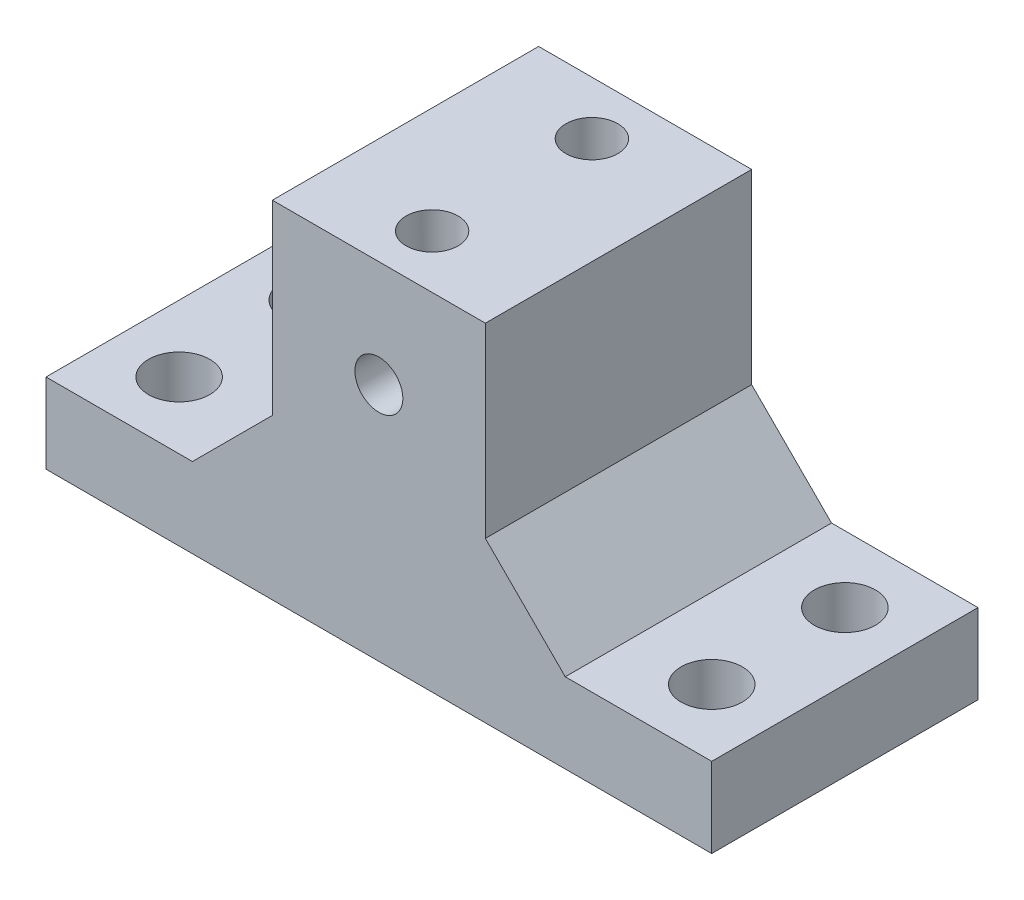
ISO-10303-21;
HEADER;
FILE_DESCRIPTION(('STEP AP214'),'2;1');
FILE_NAME('part.step','',(''),(''),'','','');
FILE_SCHEMA(('AUTOMOTIVE_DESIGN { 1 0 10303 214 1 1 1 1 }'));
ENDSEC;
DATA;
#1=APPLICATION_CONTEXT('core data for automotive mechanical design processes');
#2=APPLICATION_PROTOCOL_DEFINITION('international standard','automotive_design',2000,#1);
#3=PRODUCT_CONTEXT('',#1,'mechanical');
#4=PRODUCT('Part','Part','',(#3));
#5=PRODUCT_RELATED_PRODUCT_CATEGORY('part','',(#4));
#6=PRODUCT_DEFINITION_FORMATION('','',#4);
#7=PRODUCT_DEFINITION_CONTEXT('part definition',#1,'design');
#8=PRODUCT_DEFINITION('design','',#6,#7);
#9=PRODUCT_DEFINITION_SHAPE('','',#8);
#10=(LENGTH_UNIT() NAMED_UNIT(*) SI_UNIT(.MILLI.,.METRE.));
#11=(NAMED_UNIT(*) PLANE_ANGLE_UNIT() SI_UNIT($,.RADIAN.));
#12=(NAMED_UNIT(*) SI_UNIT($,.STERADIAN.) SOLID_ANGLE_UNIT());
#13=UNCERTAINTY_MEASURE_WITH_UNIT(LENGTH_MEASURE(1.E-05),#10,'distance_accuracy_value','');
#14=(GEOMETRIC_REPRESENTATION_CONTEXT(3) GLOBAL_UNCERTAINTY_ASSIGNED_CONTEXT((#13)) GLOBAL_UNIT_ASSIGNED_CONTEXT((#10,
#11,#12)) REPRESENTATION_CONTEXT('',''));
#15=CARTESIAN_POINT('',(0.,0.,0.));
#16=DIRECTION('',(0.,0.,1.));
#17=DIRECTION('',(1.,0.,0.));
#18=AXIS2_PLACEMENT_3D('',#15,#16,#17);
#19=CARTESIAN_POINT('',(0.,9.,5.));
#20=DIRECTION('',(0.,0.,-1.));
#21=DIRECTION('',(-1.,0.,0.));
#22=AXIS2_PLACEMENT_3D('',#19,#20,#21);
#23=CYLINDRICAL_SURFACE('',#22,0.9);
#24=DIRECTION('',(0.,0.,-1.));
#25=VECTOR('',#24,1.);
#26=CARTESIAN_POINT('',(0.748331477354789,9.5,5.));
#27=LINE('',#26,#25);
#28=CARTESIAN_POINT('',(0.748331477354789,9.5,-3.62500000000001));
#29=VERTEX_POINT('',#28);
#30=CARTESIAN_POINT('',(0.748331477354789,9.5,-2.375));
#31=VERTEX_POINT('',#30);
#32=EDGE_CURVE('E200',#29,#31,#27,.F.);
#33=ORIENTED_EDGE('',*,*,#32,.F.);
#34=CARTESIAN_POINT('',(0.748331477354789,9.5,-3.62500000000001));
#35=CARTESIAN_POINT('',(0.733924269891504,9.52154477751129,-3.6422490531976));
#36=CARTESIAN_POINT('',(0.718578885408009,9.54251308621305,-3.65941026645327));
#37=CARTESIAN_POINT('',(0.685911055676356,9.58327909091887,-3.693330659847));
#38=CARTESIAN_POINT('',(0.668585255730175,9.60307471172623,-3.71008909782588));
#39=CARTESIAN_POINT('',(0.613236830258081,9.66091011870187,-3.75962369621174));
#40=CARTESIAN_POINT('',(0.572098248732012,9.6970104059337,-3.79134087464803));
#41=CARTESIAN_POINT('',(0.493298849816799,9.75389963460294,-3.84194485571653));
#42=CARTESIAN_POINT('',(0.45751133756575,9.77622981088076,-3.86202417811574));
#43=CARTESIAN_POINT('',(0.381674185466681,9.81617959913372,-3.89816550918432));
#44=CARTESIAN_POINT('',(0.341642222860576,9.83381775200206,-3.91424331342636));
#45=CARTESIAN_POINT('',(0.264338502822068,9.86112585405695,-3.93922177602969));
#46=CARTESIAN_POINT('',(0.227588421267277,9.87160389569283,-3.94884579537935));
#47=CARTESIAN_POINT('',(0.152193833043917,9.88787484516845,-3.96381346331423));
#48=CARTESIAN_POINT('',(0.113549312703479,9.8936677191908,-3.96915708100363));
#49=CARTESIAN_POINT('',(0.0353491706181292,9.90016316788724,-3.97514980097303));
#50=CARTESIAN_POINT('',(-0.00420880675999397,9.90085064433701,-3.97578497894461));
#51=CARTESIAN_POINT('',(-0.0828547161948614,9.8970425513315,-3.97227044712237));
#52=CARTESIAN_POINT('',(-0.121942637397505,9.89254686242269,-3.96812062705137));
#53=CARTESIAN_POINT('',(-0.196594220862562,9.87904499184437,-3.95568749062408));
#54=CARTESIAN_POINT('',(-0.232236710727224,9.87027079523202,-3.94761684139698));
#55=CARTESIAN_POINT('',(-0.301294462499184,9.84884074498252,-3.92797492866569));
#56=CARTESIAN_POINT('',(-0.33470942379642,9.83618436872209,-3.91640319384439));
#57=CARTESIAN_POINT('',(-0.410964096228035,9.80215197573637,-3.88544039996904));
#58=CARTESIAN_POINT('',(-0.452610168726625,9.77928736420383,-3.86474599339474));
#59=CARTESIAN_POINT('',(-0.53042764849317,9.72857095464448,-3.81933735295521));
#60=CARTESIAN_POINT('',(-0.566579595376692,9.70070215836203,-3.79460944513422));
#61=CARTESIAN_POINT('',(-0.628894552480811,9.64498530037335,-3.74596607812786));
#62=CARTESIAN_POINT('',(-0.6557458542859,9.61761485613098,-3.7223701606621));
#63=CARTESIAN_POINT('',(-0.705137338486416,9.56051810214198,-3.67423177634202));
#64=CARTESIAN_POINT('',(-0.727711628121605,9.53081335876058,-3.64969885193285));
#65=CARTESIAN_POINT('',(-0.748331477354789,9.5,-3.625));
#66=B_SPLINE_CURVE_WITH_KNOTS('',3,(#34,#35,#36,#37,#38,#39,#40,#41,#42,#43,#44,#45,#46,#47,#48,
#49,#50,#51,#52,#53,#54,#55,#56,#57,#58,#59,#60,#61,#62,#63,#64,#65),.UNSPECIFIED.,.F.,.F.,(4,2,
2,2,2,2,2,2,2,2,2,2,2,2,2,4),(0.,0.0933478219049207,0.186856180296549,0.375544950403531,
0.515210934612567,0.6543165314592,0.772038439908563,0.889761198063643,1.00783196035178,
1.12590544380543,1.2381891112541,1.35048790109173,1.50510577060662,1.660259140389,
1.79504320080564,1.92870245869332),.UNSPECIFIED.);
#67=CARTESIAN_POINT('',(-0.748331477354789,9.5,-3.625));
#68=VERTEX_POINT('',#67);
#69=EDGE_CURVE('E194',#29,#68,#66,.T.);
#70=ORIENTED_EDGE('',*,*,#69,.T.);
#71=DIRECTION('',(0.,0.,-1.));
#72=VECTOR('',#71,1.);
#73=CARTESIAN_POINT('',(-0.748331477354789,9.5,5.));
#74=LINE('',#73,#72);
#75=CARTESIAN_POINT('',(-0.748331477354789,9.5,-2.37500000000001));
#76=VERTEX_POINT('',#75);
#77=EDGE_CURVE('E310',#76,#68,#74,.T.);
#78=ORIENTED_EDGE('',*,*,#77,.F.);
#79=CARTESIAN_POINT('',(-0.748331477354789,9.5,-2.37500000000001));
#80=CARTESIAN_POINT('',(-0.733924269891504,9.52154477751129,-2.35775094680241));
#81=CARTESIAN_POINT('',(-0.718578885408008,9.54251308621305,-2.34058973354675));
#82=CARTESIAN_POINT('',(-0.685911055676356,9.58327909091887,-2.30666934015301));
#83=CARTESIAN_POINT('',(-0.668585255730175,9.60307471172623,-2.28991090217413));
#84=CARTESIAN_POINT('',(-0.61323683025808,9.66091011870187,-2.24037630378827));
#85=CARTESIAN_POINT('',(-0.572098248732011,9.6970104059337,-2.20865912535198));
#86=CARTESIAN_POINT('',(-0.493298849816796,9.75389963460294,-2.15805514428347));
#87=CARTESIAN_POINT('',(-0.457511337565748,9.77622981088076,-2.13797582188427));
#88=CARTESIAN_POINT('',(-0.381674185466679,9.81617959913372,-2.10183449081569));
#89=CARTESIAN_POINT('',(-0.341642222860575,9.83381775200206,-2.08575668657364));
#90=CARTESIAN_POINT('',(-0.264338502822066,9.86112585405695,-2.06077822397032));
#91=CARTESIAN_POINT('',(-0.227588421267276,9.87160389569283,-2.05115420462066));
#92=CARTESIAN_POINT('',(-0.152193833043915,9.88787484516845,-2.03618653668578));
#93=CARTESIAN_POINT('',(-0.113549312703477,9.8936677191908,-2.03084291899638));
#94=CARTESIAN_POINT('',(-0.0353491706181273,9.90016316788724,-2.02485019902697));
#95=CARTESIAN_POINT('',(0.00420880675999596,9.90085064433702,-2.02421502105539));
#96=CARTESIAN_POINT('',(0.0828547161948636,9.8970425513315,-2.02772955287763));
#97=CARTESIAN_POINT('',(0.121942637397507,9.89254686242269,-2.03187937294864));
#98=CARTESIAN_POINT('',(0.196594220862565,9.87904499184437,-2.04431250937593));
#99=CARTESIAN_POINT('',(0.232236710727227,9.87027079523202,-2.05238315860302));
#100=CARTESIAN_POINT('',(0.301294462499186,9.84884074498252,-2.07202507133431));
#101=CARTESIAN_POINT('',(0.334709423796423,9.83618436872209,-2.08359680615561));
#102=CARTESIAN_POINT('',(0.410964096228038,9.80215197573637,-2.11455960003097));
#103=CARTESIAN_POINT('',(0.452610168726626,9.77928736420383,-2.13525400660526));
#104=CARTESIAN_POINT('',(0.530427648493171,9.72857095464447,-2.18066264704478));
#105=CARTESIAN_POINT('',(0.566579595376694,9.70070215836203,-2.20539055486578));
#106=CARTESIAN_POINT('',(0.628894552480813,9.64498530037335,-2.25403392187214));
#107=CARTESIAN_POINT('',(0.655745854285902,9.61761485613097,-2.2776298393379));
#108=CARTESIAN_POINT('',(0.705137338486418,9.56051810214198,-2.32576822365797));
#109=CARTESIAN_POINT('',(0.727711628121606,9.53081335876058,-2.35030114806714));
#110=CARTESIAN_POINT('',(0.748331477354789,9.5,-2.375));
#111=B_SPLINE_CURVE_WITH_KNOTS('',3,(#79,#80,#81,#82,#83,#84,#85,#86,#87,#88,#89,#90,#91,#92,
#93,#94,#95,#96,#97,#98,#99,#100,#101,#102,#103,#104,#105,#106,#107,#108,#109,#110),
.UNSPECIFIED.,.F.,.F.,(4,2,2,2,2,2,2,2,2,2,2,2,2,2,2,4),(0.,0.0933478219049211,0.18685618029655,
0.375544950403536,0.515210934612571,0.654316531459204,0.772038439908567,0.889761198063647,
1.00783196035178,1.12590544380544,1.23818911125411,1.35048790109173,1.50510577060662,
1.66025914038901,1.79504320080565,1.92870245869332),.UNSPECIFIED.);
#112=EDGE_CURVE('E188',#76,#31,#111,.T.);
#113=ORIENTED_EDGE('',*,*,#112,.T.);
#114=EDGE_LOOP('',(#33,#70,#78,#113));
#115=FACE_BOUND('',#114,.T.);
#116=CARTESIAN_POINT('',(0.,9.,5.));
#117=DIRECTION('',(0.,0.,-1.));
#118=DIRECTION('',(-1.,0.,0.));
#119=AXIS2_PLACEMENT_3D('',#116,#117,#118);
#120=CIRCLE('',#119,0.9);
#121=CARTESIAN_POINT('',(-0.9,9.,5.));
#122=VERTEX_POINT('',#121);
#123=EDGE_CURVE('E253',#122,#122,#120,.T.);
#124=ORIENTED_EDGE('',*,*,#123,.F.);
#125=EDGE_LOOP('',(#124));
#126=FACE_BOUND('',#125,.T.);
#127=CARTESIAN_POINT('',(0.,9.,-5.));
#128=DIRECTION('',(0.,0.,-1.));
#129=DIRECTION('',(-1.,0.,0.));
#130=AXIS2_PLACEMENT_3D('',#127,#128,#129);
#131=CIRCLE('',#130,0.9);
#132=CARTESIAN_POINT('',(-0.9,9.,-5.));
#133=VERTEX_POINT('',#132);
#134=EDGE_CURVE('E324',#133,#133,#131,.T.);
#135=ORIENTED_EDGE('',*,*,#134,.T.);
#136=EDGE_LOOP('',(#135));
#137=FACE_BOUND('',#136,.T.);
#138=DIRECTION('',(0.,0.,-1.));
#139=VECTOR('',#138,1.);
#140=CARTESIAN_POINT('',(0.748331477354789,9.5,5.));
#141=LINE('',#140,#139);
#142=CARTESIAN_POINT('',(0.748331477354789,9.5,2.375));
#143=VERTEX_POINT('',#142);
#144=CARTESIAN_POINT('',(0.748331477354789,9.5,3.62500000000001));
#145=VERTEX_POINT('',#144);
#146=EDGE_CURVE('E133',#143,#145,#141,.F.);
#147=ORIENTED_EDGE('',*,*,#146,.F.);
#148=CARTESIAN_POINT('',(0.748331477354789,9.5,2.375));
#149=CARTESIAN_POINT('',(0.733924269891504,9.52154477751129,2.3577509468024));
#150=CARTESIAN_POINT('',(0.718578885408009,9.54251308621305,2.34058973354673));
#151=CARTESIAN_POINT('',(0.685911055676357,9.58327909091887,2.306669340153));
#152=CARTESIAN_POINT('',(0.668585255730176,9.60307471172623,2.28991090217412));
#153=CARTESIAN_POINT('',(0.613236830258081,9.66091011870187,2.24037630378826));
#154=CARTESIAN_POINT('',(0.572098248732012,9.6970104059337,2.20865912535198));
#155=CARTESIAN_POINT('',(0.493298849816798,9.75389963460294,2.15805514428347));
#156=CARTESIAN_POINT('',(0.45751133756575,9.77622981088076,2.13797582188427));
#157=CARTESIAN_POINT('',(0.381674185466681,9.81617959913372,2.10183449081568));
#158=CARTESIAN_POINT('',(0.341642222860576,9.83381775200206,2.08575668657364));
#159=CARTESIAN_POINT('',(0.264338502822067,9.86112585405695,2.06077822397031));
#160=CARTESIAN_POINT('',(0.227588421267277,9.87160389569283,2.05115420462066));
#161=CARTESIAN_POINT('',(0.152193833043917,9.88787484516845,2.03618653668578));
#162=CARTESIAN_POINT('',(0.113549312703478,9.8936677191908,2.03084291899638));
#163=CARTESIAN_POINT('',(0.0353491706181287,9.90016316788724,2.02485019902697));
#164=CARTESIAN_POINT('',(-0.00420880675999451,9.90085064433701,2.02421502105539));
#165=CARTESIAN_POINT('',(-0.0828547161948619,9.8970425513315,2.02772955287763));
#166=CARTESIAN_POINT('',(-0.121942637397505,9.89254686242269,2.03187937294864));
#167=CARTESIAN_POINT('',(-0.196594220862563,9.87904499184437,2.04431250937593));
#168=CARTESIAN_POINT('',(-0.232236710727225,9.87027079523202,2.05238315860302));
#169=CARTESIAN_POINT('',(-0.301294462499184,9.84884074498252,2.07202507133431));
#170=CARTESIAN_POINT('',(-0.334709423796421,9.83618436872209,2.08359680615562));
#171=CARTESIAN_POINT('',(-0.410964096228036,9.80215197573637,2.11455960003097));
#172=CARTESIAN_POINT('',(-0.452610168726625,9.77928736420383,2.13525400660527));
#173=CARTESIAN_POINT('',(-0.53042764849317,9.72857095464448,2.18066264704479));
#174=CARTESIAN_POINT('',(-0.566579595376692,9.70070215836203,2.20539055486578));
#175=CARTESIAN_POINT('',(-0.628894552480811,9.64498530037335,2.25403392187215));
#176=CARTESIAN_POINT('',(-0.6557458542859,9.61761485613097,2.27762983933791));
#177=CARTESIAN_POINT('',(-0.705137338486417,9.56051810214198,2.32576822365798));
#178=CARTESIAN_POINT('',(-0.727711628121606,9.53081335876058,2.35030114806715));
#179=CARTESIAN_POINT('',(-0.748331477354789,9.5,2.37500000000001));
#180=B_SPLINE_CURVE_WITH_KNOTS('',3,(#148,#149,#150,#151,#152,#153,#154,#155,#156,#157,#158,
#159,#160,#161,#162,#163,#164,#165,#166,#167,#168,#169,#170,#171,#172,#173,#174,#175,#176,#177,
#178,#179),.UNSPECIFIED.,.F.,.F.,(4,2,2,2,2,2,2,2,2,2,2,2,2,2,2,4),(0.,0.0933478219049205,
0.186856180296549,0.375544950403531,0.515210934612566,0.654316531459199,0.772038439908562,
0.889761198063642,1.00783196035178,1.12590544380543,1.2381891112541,1.35048790109173,
1.50510577060662,1.660259140389,1.79504320080564,1.92870245869332),.UNSPECIFIED.);
#181=CARTESIAN_POINT('',(-0.748331477354789,9.5,2.37500000000001));
#182=VERTEX_POINT('',#181);
#183=EDGE_CURVE('E149',#143,#182,#180,.T.);
#184=ORIENTED_EDGE('',*,*,#183,.T.);
#185=DIRECTION('',(0.,0.,-1.));
#186=VECTOR('',#185,1.);
#187=CARTESIAN_POINT('',(-0.748331477354789,9.5,5.));
#188=LINE('',#187,#186);
#189=CARTESIAN_POINT('',(-0.748331477354789,9.5,3.62499999999999));
#190=VERTEX_POINT('',#189);
#191=EDGE_CURVE('E141',#190,#182,#188,.T.);
#192=ORIENTED_EDGE('',*,*,#191,.F.);
#193=CARTESIAN_POINT('',(-0.748331477354789,9.5,3.62499999999999));
#194=CARTESIAN_POINT('',(-0.733924269891504,9.52154477751129,3.64224905319759));
#195=CARTESIAN_POINT('',(-0.718578885408008,9.54251308621305,3.65941026645326));
#196=CARTESIAN_POINT('',(-0.685911055676356,9.58327909091887,3.69333065984699));
#197=CARTESIAN_POINT('',(-0.668585255730175,9.60307471172623,3.71008909782587));
#198=CARTESIAN_POINT('',(-0.613236830258079,9.66091011870187,3.75962369621174));
#199=CARTESIAN_POINT('',(-0.57209824873201,9.6970104059337,3.79134087464802));
#200=CARTESIAN_POINT('',(-0.493298849816796,9.75389963460294,3.84194485571653));
#201=CARTESIAN_POINT('',(-0.457511337565747,9.77622981088076,3.86202417811573));
#202=CARTESIAN_POINT('',(-0.381674185466679,9.81617959913372,3.89816550918431));
#203=CARTESIAN_POINT('',(-0.341642222860574,9.83381775200206,3.91424331342636));
#204=CARTESIAN_POINT('',(-0.264338502822066,9.86112585405695,3.93922177602969));
#205=CARTESIAN_POINT('',(-0.227588421267276,9.87160389569283,3.94884579537935));
#206=CARTESIAN_POINT('',(-0.152193833043915,9.88787484516845,3.96381346331422));
#207=CARTESIAN_POINT('',(-0.113549312703477,9.8936677191908,3.96915708100363));
#208=CARTESIAN_POINT('',(-0.0353491706181273,9.90016316788724,3.97514980097304));
#209=CARTESIAN_POINT('',(0.00420880675999609,9.90085064433702,3.97578497894461));
#210=CARTESIAN_POINT('',(0.0828547161948637,9.8970425513315,3.97227044712237));
#211=CARTESIAN_POINT('',(0.121942637397507,9.89254686242269,3.96812062705137));
#212=CARTESIAN_POINT('',(0.196594220862565,9.87904499184437,3.95568749062408));
#213=CARTESIAN_POINT('',(0.232236710727227,9.87027079523202,3.94761684139698));
#214=CARTESIAN_POINT('',(0.301294462499187,9.84884074498251,3.92797492866569));
#215=CARTESIAN_POINT('',(0.334709423796424,9.83618436872209,3.91640319384439));
#216=CARTESIAN_POINT('',(0.410964096228039,9.80215197573637,3.88544039996904));
#217=CARTESIAN_POINT('',(0.452610168726628,9.77928736420383,3.86474599339474));
#218=CARTESIAN_POINT('',(0.530427648493173,9.72857095464447,3.81933735295522));
#219=CARTESIAN_POINT('',(0.566579595376695,9.70070215836203,3.79460944513423));
#220=CARTESIAN_POINT('',(0.628894552480812,9.64498530037335,3.74596607812787));
#221=CARTESIAN_POINT('',(0.655745854285901,9.61761485613097,3.72237016066211));
#222=CARTESIAN_POINT('',(0.705137338486417,9.56051810214198,3.67423177634203));
#223=CARTESIAN_POINT('',(0.727711628121606,9.53081335876058,3.64969885193287));
#224=CARTESIAN_POINT('',(0.748331477354789,9.5,3.62500000000001));
#225=B_SPLINE_CURVE_WITH_KNOTS('',3,(#193,#194,#195,#196,#197,#198,#199,#200,#201,#202,#203,
#204,#205,#206,#207,#208,#209,#210,#211,#212,#213,#214,#215,#216,#217,#218,#219,#220,#221,#222,
#223,#224),.UNSPECIFIED.,.F.,.F.,(4,2,2,2,2,2,2,2,2,2,2,2,2,2,2,4),(0.,0.0933478219049215,
0.186856180296553,0.375544950403537,0.515210934612572,0.654316531459204,0.772038439908568,
0.889761198063649,1.00783196035178,1.12590544380544,1.23818911125411,1.35048790109174,
1.50510577060662,1.66025914038901,1.79504320080565,1.92870245869332),.UNSPECIFIED.);
#226=EDGE_CURVE('E147',#190,#145,#225,.T.);
#227=ORIENTED_EDGE('',*,*,#226,.T.);
#228=EDGE_LOOP('',(#147,#184,#192,#227));
#229=FACE_BOUND('',#228,.T.);
#230=ADVANCED_FACE('F33',(#115,#126,#137,#229),#23,.F.);
#231=CARTESIAN_POINT('',(0.,3.,0.));
#232=DIRECTION('',(0.,-1.,0.));
#233=DIRECTION('',(0.,0.,-1.));
#234=AXIS2_PLACEMENT_3D('',#231,#232,#233);
#235=PLANE('',#234);
#236=CARTESIAN_POINT('',(10.,3.,2.5));
#237=DIRECTION('',(0.,1.,0.));
#238=DIRECTION('',(0.,0.,1.));
#239=AXIS2_PLACEMENT_3D('',#236,#237,#238);
#240=CIRCLE('',#239,1.15);
#241=CARTESIAN_POINT('',(10.,3.,3.65));
#242=VERTEX_POINT('',#241);
#243=EDGE_CURVE('E260',#242,#242,#240,.T.);
#244=ORIENTED_EDGE('',*,*,#243,.F.);
#245=EDGE_LOOP('',(#244));
#246=FACE_BOUND('',#245,.T.);
#247=CARTESIAN_POINT('',(10.,3.,-2.5));
#248=DIRECTION('',(0.,1.,0.));
#249=DIRECTION('',(0.,0.,1.));
#250=AXIS2_PLACEMENT_3D('',#247,#248,#249);
#251=CIRCLE('',#250,1.15);
#252=CARTESIAN_POINT('',(10.,3.,-1.35));
#253=VERTEX_POINT('',#252);
#254=EDGE_CURVE('E268',#253,#253,#251,.T.);
#255=ORIENTED_EDGE('',*,*,#254,.F.);
#256=EDGE_LOOP('',(#255));
#257=FACE_BOUND('',#256,.T.);
#258=DIRECTION('',(-1.,0.,0.));
#259=VECTOR('',#258,1.);
#260=CARTESIAN_POINT('',(-12.5,3.,-5.));
#261=LINE('',#260,#259);
#262=CARTESIAN_POINT('',(12.5,3.,-5.));
#263=VERTEX_POINT('',#262);
#264=CARTESIAN_POINT('',(7.00000000000002,3.,-5.));
#265=VERTEX_POINT('',#264);
#266=EDGE_CURVE('E290',#263,#265,#261,.T.);
#267=ORIENTED_EDGE('',*,*,#266,.T.);
#268=DIRECTION('',(0.,0.,1.));
#269=VECTOR('',#268,1.);
#270=CARTESIAN_POINT('',(7.00000000000002,3.,0.));
#271=LINE('',#270,#269);
#272=CARTESIAN_POINT('',(7.00000000000002,3.,5.));
#273=VERTEX_POINT('',#272);
#274=EDGE_CURVE('E207',#265,#273,#271,.T.);
#275=ORIENTED_EDGE('',*,*,#274,.T.);
#276=DIRECTION('',(1.,0.,0.));
#277=VECTOR('',#276,1.);
#278=CARTESIAN_POINT('',(-12.5,3.,5.));
#279=LINE('',#278,#277);
#280=CARTESIAN_POINT('',(12.5,3.,5.));
#281=VERTEX_POINT('',#280);
#282=EDGE_CURVE('E234',#273,#281,#279,.T.);
#283=ORIENTED_EDGE('',*,*,#282,.T.);
#284=DIRECTION('',(0.,0.,-1.));
#285=VECTOR('',#284,1.);
#286=CARTESIAN_POINT('',(12.5,3.,5.));
#287=LINE('',#286,#285);
#288=EDGE_CURVE('E286',#281,#263,#287,.T.);
#289=ORIENTED_EDGE('',*,*,#288,.T.);
#290=EDGE_LOOP('',(#267,#275,#283,#289));
#291=FACE_BOUND('',#290,.T.);
#292=ADVANCED_FACE('F342',(#246,#257,#291),#235,.F.);
#293=CARTESIAN_POINT('',(-12.5,3.,5.));
#294=VERTEX_POINT('',#293);
#295=CARTESIAN_POINT('',(-7.00000000000002,3.,5.));
#296=VERTEX_POINT('',#295);
#297=EDGE_CURVE('E220',#294,#296,#279,.T.);
#298=ORIENTED_EDGE('',*,*,#297,.T.);
#299=DIRECTION('',(0.,0.,-1.));
#300=VECTOR('',#299,1.);
#301=CARTESIAN_POINT('',(-7.00000000000002,3.,0.));
#302=LINE('',#301,#300);
#303=CARTESIAN_POINT('',(-7.00000000000002,3.,-5.));
#304=VERTEX_POINT('',#303);
#305=EDGE_CURVE('E140',#296,#304,#302,.T.);
#306=ORIENTED_EDGE('',*,*,#305,.T.);
#307=CARTESIAN_POINT('',(-12.5,3.,-5.));
#308=VERTEX_POINT('',#307);
#309=EDGE_CURVE('E243',#304,#308,#261,.T.);
#310=ORIENTED_EDGE('',*,*,#309,.T.);
#311=DIRECTION('',(0.,0.,1.));
#312=VECTOR('',#311,1.);
#313=CARTESIAN_POINT('',(-12.5,3.,5.));
#314=LINE('',#313,#312);
#315=EDGE_CURVE('E231',#308,#294,#314,.T.);
#316=ORIENTED_EDGE('',*,*,#315,.T.);
#317=EDGE_LOOP('',(#298,#306,#310,#316));
#318=FACE_BOUND('',#317,.T.);
#319=CARTESIAN_POINT('',(-10.,3.,-2.5));
#320=DIRECTION('',(0.,1.,0.));
#321=DIRECTION('',(0.,0.,1.));
#322=AXIS2_PLACEMENT_3D('',#319,#320,#321);
#323=CIRCLE('',#322,1.15);
#324=CARTESIAN_POINT('',(-10.,3.,-1.35));
#325=VERTEX_POINT('',#324);
#326=EDGE_CURVE('E280',#325,#325,#323,.T.);
#327=ORIENTED_EDGE('',*,*,#326,.F.);
#328=EDGE_LOOP('',(#327));
#329=FACE_BOUND('',#328,.T.);
#330=CARTESIAN_POINT('',(-10.,3.,2.5));
#331=DIRECTION('',(0.,1.,0.));
#332=DIRECTION('',(0.,0.,1.));
#333=AXIS2_PLACEMENT_3D('',#330,#331,#332);
#334=CIRCLE('',#333,1.15);
#335=CARTESIAN_POINT('',(-10.,3.,3.65));
#336=VERTEX_POINT('',#335);
#337=EDGE_CURVE('E274',#336,#336,#334,.T.);
#338=ORIENTED_EDGE('',*,*,#337,.F.);
#339=EDGE_LOOP('',(#338));
#340=FACE_BOUND('',#339,.T.);
#341=ADVANCED_FACE('F227',(#318,#329,#340),#235,.F.);
#342=CARTESIAN_POINT('',(0.,0.,0.));
#343=DIRECTION('',(0.,-1.,0.));
#344=DIRECTION('',(0.,0.,-1.));
#345=AXIS2_PLACEMENT_3D('',#342,#343,#344);
#346=PLANE('',#345);
#347=DIRECTION('',(0.,0.,1.));
#348=VECTOR('',#347,1.);
#349=CARTESIAN_POINT('',(-12.5,0.,5.));
#350=LINE('',#349,#348);
#351=CARTESIAN_POINT('',(-12.5,0.,-5.));
#352=VERTEX_POINT('',#351);
#353=CARTESIAN_POINT('',(-12.5,0.,5.));
#354=VERTEX_POINT('',#353);
#355=EDGE_CURVE('E298',#352,#354,#350,.T.);
#356=ORIENTED_EDGE('',*,*,#355,.F.);
#357=DIRECTION('',(-1.,0.,0.));
#358=VECTOR('',#357,1.);
#359=CARTESIAN_POINT('',(-12.5,0.,-5.));
#360=LINE('',#359,#358);
#361=CARTESIAN_POINT('',(12.5,0.,-5.));
#362=VERTEX_POINT('',#361);
#363=EDGE_CURVE('E296',#362,#352,#360,.T.);
#364=ORIENTED_EDGE('',*,*,#363,.F.);
#365=DIRECTION('',(0.,0.,-1.));
#366=VECTOR('',#365,1.);
#367=CARTESIAN_POINT('',(12.5,0.,5.));
#368=LINE('',#367,#366);
#369=CARTESIAN_POINT('',(12.5,0.,5.));
#370=VERTEX_POINT('',#369);
#371=EDGE_CURVE('E283',#370,#362,#368,.T.);
#372=ORIENTED_EDGE('',*,*,#371,.F.);
#373=DIRECTION('',(1.,0.,0.));
#374=VECTOR('',#373,1.);
#375=CARTESIAN_POINT('',(-12.5,0.,5.));
#376=LINE('',#375,#374);
#377=EDGE_CURVE('E289',#354,#370,#376,.T.);
#378=ORIENTED_EDGE('',*,*,#377,.F.);
#379=EDGE_LOOP('',(#356,#364,#372,#378));
#380=FACE_BOUND('',#379,.T.);
#381=CARTESIAN_POINT('',(-10.,0.,-2.5));
#382=DIRECTION('',(0.,1.,0.));
#383=DIRECTION('',(0.,0.,1.));
#384=AXIS2_PLACEMENT_3D('',#381,#382,#383);
#385=CIRCLE('',#384,1.15);
#386=CARTESIAN_POINT('',(-10.,0.,-1.35));
#387=VERTEX_POINT('',#386);
#388=EDGE_CURVE('E277',#387,#387,#385,.T.);
#389=ORIENTED_EDGE('',*,*,#388,.T.);
#390=EDGE_LOOP('',(#389));
#391=FACE_BOUND('',#390,.T.);
#392=CARTESIAN_POINT('',(-10.,0.,2.5));
#393=DIRECTION('',(0.,1.,0.));
#394=DIRECTION('',(0.,0.,1.));
#395=AXIS2_PLACEMENT_3D('',#392,#393,#394);
#396=CIRCLE('',#395,1.15);
#397=CARTESIAN_POINT('',(-10.,0.,3.65));
#398=VERTEX_POINT('',#397);
#399=EDGE_CURVE('E271',#398,#398,#396,.T.);
#400=ORIENTED_EDGE('',*,*,#399,.T.);
#401=EDGE_LOOP('',(#400));
#402=FACE_BOUND('',#401,.T.);
#403=CARTESIAN_POINT('',(10.,0.,2.5));
#404=DIRECTION('',(0.,1.,0.));
#405=DIRECTION('',(0.,0.,1.));
#406=AXIS2_PLACEMENT_3D('',#403,#404,#405);
#407=CIRCLE('',#406,1.15);
#408=CARTESIAN_POINT('',(10.,0.,3.65));
#409=VERTEX_POINT('',#408);
#410=EDGE_CURVE('E264',#409,#409,#407,.T.);
#411=ORIENTED_EDGE('',*,*,#410,.T.);
#412=EDGE_LOOP('',(#411));
#413=FACE_BOUND('',#412,.T.);
#414=CARTESIAN_POINT('',(10.,0.,-2.5));
#415=DIRECTION('',(0.,1.,0.));
#416=DIRECTION('',(0.,0.,1.));
#417=AXIS2_PLACEMENT_3D('',#414,#415,#416);
#418=CIRCLE('',#417,1.15);
#419=CARTESIAN_POINT('',(10.,0.,-1.35));
#420=VERTEX_POINT('',#419);
#421=EDGE_CURVE('E263',#420,#420,#418,.T.);
#422=ORIENTED_EDGE('',*,*,#421,.T.);
#423=EDGE_LOOP('',(#422));
#424=FACE_BOUND('',#423,.T.);
#425=ADVANCED_FACE('F354',(#380,#391,#402,#413,#424),#346,.T.);
#426=CARTESIAN_POINT('',(12.5,3.,5.));
#427=DIRECTION('',(-1.,0.,0.));
#428=DIRECTION('',(0.,0.,1.));
#429=AXIS2_PLACEMENT_3D('',#426,#427,#428);
#430=PLANE('',#429);
#431=ORIENTED_EDGE('',*,*,#371,.T.);
#432=DIRECTION('',(0.,-1.,0.));
#433=VECTOR('',#432,1.);
#434=CARTESIAN_POINT('',(12.5,3.,-5.));
#435=LINE('',#434,#433);
#436=EDGE_CURVE('E308',#263,#362,#435,.T.);
#437=ORIENTED_EDGE('',*,*,#436,.F.);
#438=ORIENTED_EDGE('',*,*,#288,.F.);
#439=DIRECTION('',(0.,-1.,0.));
#440=VECTOR('',#439,1.);
#441=CARTESIAN_POINT('',(12.5,3.,5.));
#442=LINE('',#441,#440);
#443=EDGE_CURVE('E233',#281,#370,#442,.T.);
#444=ORIENTED_EDGE('',*,*,#443,.T.);
#445=EDGE_LOOP('',(#431,#437,#438,#444));
#446=FACE_BOUND('',#445,.T.);
#447=ADVANCED_FACE('F349',(#446),#430,.F.);
#448=CARTESIAN_POINT('',(-12.5,3.,-5.));
#449=DIRECTION('',(0.,0.,1.));
#450=DIRECTION('',(1.,0.,0.));
#451=AXIS2_PLACEMENT_3D('',#448,#449,#450);
#452=PLANE('',#451);
#453=ORIENTED_EDGE('',*,*,#134,.F.);
#454=EDGE_LOOP('',(#453));
#455=FACE_BOUND('',#454,.T.);
#456=ORIENTED_EDGE('',*,*,#309,.F.);
#457=DIRECTION('',(0.707106781186552,0.707106781186543,0.));
#458=VECTOR('',#457,1.);
#459=CARTESIAN_POINT('',(-9.75000000000004,0.250000000000008,-5.));
#460=LINE('',#459,#458);
#461=CARTESIAN_POINT('',(-4.,5.99999999999998,-5.));
#462=VERTEX_POINT('',#461);
#463=EDGE_CURVE('E211',#304,#462,#460,.T.);
#464=ORIENTED_EDGE('',*,*,#463,.T.);
#465=DIRECTION('',(0.,1.,0.));
#466=VECTOR('',#465,1.);
#467=CARTESIAN_POINT('',(-4.,0.,-5.));
#468=LINE('',#467,#466);
#469=CARTESIAN_POINT('',(-4.,13.,-5.));
#470=VERTEX_POINT('',#469);
#471=EDGE_CURVE('E240',#462,#470,#468,.T.);
#472=ORIENTED_EDGE('',*,*,#471,.T.);
#473=DIRECTION('',(1.,0.,0.));
#474=VECTOR('',#473,1.);
#475=CARTESIAN_POINT('',(4.,13.,-5.));
#476=LINE('',#475,#474);
#477=CARTESIAN_POINT('',(4.,13.,-5.));
#478=VERTEX_POINT('',#477);
#479=EDGE_CURVE('E249',#470,#478,#476,.T.);
#480=ORIENTED_EDGE('',*,*,#479,.T.);
#481=DIRECTION('',(0.,-1.,0.));
#482=VECTOR('',#481,1.);
#483=CARTESIAN_POINT('',(4.,0.,-5.));
#484=LINE('',#483,#482);
#485=CARTESIAN_POINT('',(4.,5.99999999999999,-5.));
#486=VERTEX_POINT('',#485);
#487=EDGE_CURVE('E250',#478,#486,#484,.T.);
#488=ORIENTED_EDGE('',*,*,#487,.T.);
#489=DIRECTION('',(0.707106781186552,-0.707106781186543,0.));
#490=VECTOR('',#489,1.);
#491=CARTESIAN_POINT('',(-2.75000000000011,12.75,-5.));
#492=LINE('',#491,#490);
#493=EDGE_CURVE('E11',#486,#265,#492,.T.);
#494=ORIENTED_EDGE('',*,*,#493,.T.);
#495=ORIENTED_EDGE('',*,*,#266,.F.);
#496=ORIENTED_EDGE('',*,*,#436,.T.);
#497=ORIENTED_EDGE('',*,*,#363,.T.);
#498=DIRECTION('',(0.,-1.,0.));
#499=VECTOR('',#498,1.);
#500=CARTESIAN_POINT('',(-12.5,3.,-5.));
#501=LINE('',#500,#499);
#502=EDGE_CURVE('E305',#308,#352,#501,.T.);
#503=ORIENTED_EDGE('',*,*,#502,.F.);
#504=EDGE_LOOP('',(#456,#464,#472,#480,#488,#494,#495,#496,#497,#503));
#505=FACE_BOUND('',#504,.T.);
#506=ADVANCED_FACE('F238',(#455,#505),#452,.F.);
#507=CARTESIAN_POINT('',(-12.5,3.,5.));
#508=DIRECTION('',(1.,0.,0.));
#509=DIRECTION('',(0.,0.,-1.));
#510=AXIS2_PLACEMENT_3D('',#507,#508,#509);
#511=PLANE('',#510);
#512=ORIENTED_EDGE('',*,*,#355,.T.);
#513=DIRECTION('',(0.,-1.,0.));
#514=VECTOR('',#513,1.);
#515=CARTESIAN_POINT('',(-12.5,3.,5.));
#516=LINE('',#515,#514);
#517=EDGE_CURVE('E303',#294,#354,#516,.T.);
#518=ORIENTED_EDGE('',*,*,#517,.F.);
#519=ORIENTED_EDGE('',*,*,#315,.F.);
#520=ORIENTED_EDGE('',*,*,#502,.T.);
#521=EDGE_LOOP('',(#512,#518,#519,#520));
#522=FACE_BOUND('',#521,.T.);
#523=ADVANCED_FACE('F353',(#522),#511,.F.);
#524=CARTESIAN_POINT('',(-12.5,3.,5.));
#525=DIRECTION('',(0.,0.,-1.));
#526=DIRECTION('',(-1.,0.,0.));
#527=AXIS2_PLACEMENT_3D('',#524,#525,#526);
#528=PLANE('',#527);
#529=ORIENTED_EDGE('',*,*,#123,.T.);
#530=EDGE_LOOP('',(#529));
#531=FACE_BOUND('',#530,.T.);
#532=ORIENTED_EDGE('',*,*,#377,.T.);
#533=ORIENTED_EDGE('',*,*,#443,.F.);
#534=ORIENTED_EDGE('',*,*,#282,.F.);
#535=DIRECTION('',(-0.707106781186552,0.707106781186543,0.));
#536=VECTOR('',#535,1.);
#537=CARTESIAN_POINT('',(-2.75000000000011,12.75,5.));
#538=LINE('',#537,#536);
#539=CARTESIAN_POINT('',(4.,5.99999999999999,5.));
#540=VERTEX_POINT('',#539);
#541=EDGE_CURVE('E41',#273,#540,#538,.T.);
#542=ORIENTED_EDGE('',*,*,#541,.T.);
#543=DIRECTION('',(0.,1.,0.));
#544=VECTOR('',#543,1.);
#545=CARTESIAN_POINT('',(4.,0.,5.));
#546=LINE('',#545,#544);
#547=CARTESIAN_POINT('',(4.,13.,5.));
#548=VERTEX_POINT('',#547);
#549=EDGE_CURVE('E267',#540,#548,#546,.T.);
#550=ORIENTED_EDGE('',*,*,#549,.T.);
#551=DIRECTION('',(-1.,0.,0.));
#552=VECTOR('',#551,1.);
#553=CARTESIAN_POINT('',(4.,13.,5.));
#554=LINE('',#553,#552);
#555=CARTESIAN_POINT('',(-4.,13.,5.));
#556=VERTEX_POINT('',#555);
#557=EDGE_CURVE('E333',#548,#556,#554,.T.);
#558=ORIENTED_EDGE('',*,*,#557,.T.);
#559=DIRECTION('',(0.,-1.,0.));
#560=VECTOR('',#559,1.);
#561=CARTESIAN_POINT('',(-4.,0.,5.));
#562=LINE('',#561,#560);
#563=CARTESIAN_POINT('',(-4.,5.99999999999998,5.));
#564=VERTEX_POINT('',#563);
#565=EDGE_CURVE('E222',#556,#564,#562,.T.);
#566=ORIENTED_EDGE('',*,*,#565,.T.);
#567=DIRECTION('',(-0.707106781186552,-0.707106781186543,0.));
#568=VECTOR('',#567,1.);
#569=CARTESIAN_POINT('',(-9.75000000000004,0.250000000000008,5.));
#570=LINE('',#569,#568);
#571=EDGE_CURVE('E213',#564,#296,#570,.T.);
#572=ORIENTED_EDGE('',*,*,#571,.T.);
#573=ORIENTED_EDGE('',*,*,#297,.F.);
#574=ORIENTED_EDGE('',*,*,#517,.T.);
#575=EDGE_LOOP('',(#532,#533,#534,#542,#550,#558,#566,#572,#573,#574));
#576=FACE_BOUND('',#575,.T.);
#577=ADVANCED_FACE('F218',(#531,#576),#528,.F.);
#578=CARTESIAN_POINT('',(-10.,3.,-2.5));
#579=DIRECTION('',(0.,-1.,0.));
#580=DIRECTION('',(0.,0.,-1.));
#581=AXIS2_PLACEMENT_3D('',#578,#579,#580);
#582=CYLINDRICAL_SURFACE('',#581,1.15);
#583=ORIENTED_EDGE('',*,*,#326,.T.);
#584=EDGE_LOOP('',(#583));
#585=FACE_BOUND('',#584,.T.);
#586=ORIENTED_EDGE('',*,*,#388,.F.);
#587=EDGE_LOOP('',(#586));
#588=FACE_BOUND('',#587,.T.);
#589=ADVANCED_FACE('F378',(#585,#588),#582,.F.);
#590=CARTESIAN_POINT('',(-10.,3.,2.5));
#591=DIRECTION('',(0.,-1.,0.));
#592=DIRECTION('',(0.,0.,-1.));
#593=AXIS2_PLACEMENT_3D('',#590,#591,#592);
#594=CYLINDRICAL_SURFACE('',#593,1.15);
#595=ORIENTED_EDGE('',*,*,#337,.T.);
#596=EDGE_LOOP('',(#595));
#597=FACE_BOUND('',#596,.T.);
#598=ORIENTED_EDGE('',*,*,#399,.F.);
#599=EDGE_LOOP('',(#598));
#600=FACE_BOUND('',#599,.T.);
#601=ADVANCED_FACE('F369',(#597,#600),#594,.F.);
#602=CARTESIAN_POINT('',(10.,3.,-2.5));
#603=DIRECTION('',(0.,-1.,0.));
#604=DIRECTION('',(0.,0.,-1.));
#605=AXIS2_PLACEMENT_3D('',#602,#603,#604);
#606=CYLINDRICAL_SURFACE('',#605,1.15);
#607=ORIENTED_EDGE('',*,*,#254,.T.);
#608=EDGE_LOOP('',(#607));
#609=FACE_BOUND('',#608,.T.);
#610=ORIENTED_EDGE('',*,*,#421,.F.);
#611=EDGE_LOOP('',(#610));
#612=FACE_BOUND('',#611,.T.);
#613=ADVANCED_FACE('F366',(#609,#612),#606,.F.);
#614=CARTESIAN_POINT('',(10.,3.,2.5));
#615=DIRECTION('',(0.,-1.,0.));
#616=DIRECTION('',(0.,0.,-1.));
#617=AXIS2_PLACEMENT_3D('',#614,#615,#616);
#618=CYLINDRICAL_SURFACE('',#617,1.15);
#619=ORIENTED_EDGE('',*,*,#243,.T.);
#620=EDGE_LOOP('',(#619));
#621=FACE_BOUND('',#620,.T.);
#622=ORIENTED_EDGE('',*,*,#410,.F.);
#623=EDGE_LOOP('',(#622));
#624=FACE_BOUND('',#623,.T.);
#625=ADVANCED_FACE('F368',(#621,#624),#618,.F.);
#626=CARTESIAN_POINT('',(4.,0.,20.2643375224737));
#627=DIRECTION('',(1.,0.,0.));
#628=DIRECTION('',(0.,0.,-1.));
#629=AXIS2_PLACEMENT_3D('',#626,#627,#628);
#630=PLANE('',#629);
#631=ORIENTED_EDGE('',*,*,#549,.F.);
#632=DIRECTION('',(0.,0.,-1.));
#633=VECTOR('',#632,1.);
#634=CARTESIAN_POINT('',(4.,5.99999999999999,20.2643375224737));
#635=LINE('',#634,#633);
#636=EDGE_CURVE('E54',#540,#486,#635,.T.);
#637=ORIENTED_EDGE('',*,*,#636,.T.);
#638=ORIENTED_EDGE('',*,*,#487,.F.);
#639=DIRECTION('',(0.,0.,-1.));
#640=VECTOR('',#639,1.);
#641=CARTESIAN_POINT('',(4.,13.,20.2643375224737));
#642=LINE('',#641,#640);
#643=EDGE_CURVE('E257',#548,#478,#642,.T.);
#644=ORIENTED_EDGE('',*,*,#643,.F.);
#645=EDGE_LOOP('',(#631,#637,#638,#644));
#646=FACE_BOUND('',#645,.T.);
#647=ADVANCED_FACE('F337',(#646),#630,.T.);
#648=CARTESIAN_POINT('',(-4.,0.,20.2643375224737));
#649=DIRECTION('',(-1.,0.,0.));
#650=DIRECTION('',(0.,0.,1.));
#651=AXIS2_PLACEMENT_3D('',#648,#649,#650);
#652=PLANE('',#651);
#653=ORIENTED_EDGE('',*,*,#471,.F.);
#654=DIRECTION('',(0.,0.,1.));
#655=VECTOR('',#654,1.);
#656=CARTESIAN_POINT('',(-4.,5.99999999999998,20.2643375224737));
#657=LINE('',#656,#655);
#658=EDGE_CURVE('E205',#462,#564,#657,.T.);
#659=ORIENTED_EDGE('',*,*,#658,.T.);
#660=ORIENTED_EDGE('',*,*,#565,.F.);
#661=DIRECTION('',(0.,0.,-1.));
#662=VECTOR('',#661,1.);
#663=CARTESIAN_POINT('',(-4.,13.,20.2643375224737));
#664=LINE('',#663,#662);
#665=EDGE_CURVE('E247',#556,#470,#664,.T.);
#666=ORIENTED_EDGE('',*,*,#665,.T.);
#667=EDGE_LOOP('',(#653,#659,#660,#666));
#668=FACE_BOUND('',#667,.T.);
#669=ADVANCED_FACE('F245',(#668),#652,.T.);
#670=CARTESIAN_POINT('',(4.,13.,20.2643375224737));
#671=DIRECTION('',(0.,1.,0.));
#672=DIRECTION('',(-1.,0.,0.));
#673=AXIS2_PLACEMENT_3D('',#670,#671,#672);
#674=PLANE('',#673);
#675=CARTESIAN_POINT('',(0.,13.,3.));
#676=DIRECTION('',(0.,1.,0.));
#677=DIRECTION('',(-1.,0.,0.));
#678=AXIS2_PLACEMENT_3D('',#675,#676,#677);
#679=CIRCLE('',#678,0.975);
#680=CARTESIAN_POINT('',(-0.974999999999992,13.,3.));
#681=VERTEX_POINT('',#680);
#682=EDGE_CURVE('E161',#681,#681,#679,.T.);
#683=ORIENTED_EDGE('',*,*,#682,.F.);
#684=EDGE_LOOP('',(#683));
#685=FACE_BOUND('',#684,.T.);
#686=CARTESIAN_POINT('',(0.,13.,-3.));
#687=DIRECTION('',(0.,1.,0.));
#688=DIRECTION('',(-1.,0.,0.));
#689=AXIS2_PLACEMENT_3D('',#686,#687,#688);
#690=CIRCLE('',#689,0.975);
#691=CARTESIAN_POINT('',(-0.974999999999994,13.,-3.));
#692=VERTEX_POINT('',#691);
#693=EDGE_CURVE('E153',#692,#692,#690,.T.);
#694=ORIENTED_EDGE('',*,*,#693,.F.);
#695=EDGE_LOOP('',(#694));
#696=FACE_BOUND('',#695,.T.);
#697=ORIENTED_EDGE('',*,*,#557,.F.);
#698=ORIENTED_EDGE('',*,*,#643,.T.);
#699=ORIENTED_EDGE('',*,*,#479,.F.);
#700=ORIENTED_EDGE('',*,*,#665,.F.);
#701=EDGE_LOOP('',(#697,#698,#699,#700));
#702=FACE_BOUND('',#701,.T.);
#703=ADVANCED_FACE('F184',(#685,#696,#702),#674,.T.);
#704=CARTESIAN_POINT('',(0.,9.5,-3.));
#705=DIRECTION('',(0.,1.,0.));
#706=DIRECTION('',(-1.,0.,0.));
#707=AXIS2_PLACEMENT_3D('',#704,#705,#706);
#708=CYLINDRICAL_SURFACE('',#707,0.975);
#709=ORIENTED_EDGE('',*,*,#693,.T.);
#710=EDGE_LOOP('',(#709));
#711=FACE_BOUND('',#710,.T.);
#712=CARTESIAN_POINT('',(0.,9.5,-3.));
#713=DIRECTION('',(0.,1.,0.));
#714=DIRECTION('',(-1.,0.,0.));
#715=AXIS2_PLACEMENT_3D('',#712,#713,#714);
#716=CIRCLE('',#715,0.975);
#717=EDGE_CURVE('E323',#31,#29,#716,.T.);
#718=ORIENTED_EDGE('',*,*,#717,.F.);
#719=ORIENTED_EDGE('',*,*,#112,.F.);
#720=EDGE_CURVE('E321',#68,#76,#716,.T.);
#721=ORIENTED_EDGE('',*,*,#720,.F.);
#722=ORIENTED_EDGE('',*,*,#69,.F.);
#723=EDGE_LOOP('',(#718,#719,#721,#722));
#724=FACE_BOUND('',#723,.T.);
#725=ADVANCED_FACE('F180',(#711,#724),#708,.F.);
#726=CARTESIAN_POINT('',(0.,9.5,-3.));
#727=DIRECTION('',(0.,1.,0.));
#728=DIRECTION('',(-1.,0.,0.));
#729=AXIS2_PLACEMENT_3D('',#726,#727,#728);
#730=PLANE('',#729);
#731=ORIENTED_EDGE('',*,*,#32,.T.);
#732=ORIENTED_EDGE('',*,*,#717,.T.);
#733=EDGE_LOOP('',(#731,#732));
#734=FACE_BOUND('',#733,.T.);
#735=ADVANCED_FACE('F176',(#734),#730,.T.);
#736=ORIENTED_EDGE('',*,*,#77,.T.);
#737=ORIENTED_EDGE('',*,*,#720,.T.);
#738=EDGE_LOOP('',(#736,#737));
#739=FACE_BOUND('',#738,.T.);
#740=ADVANCED_FACE('F179',(#739),#730,.T.);
#741=CARTESIAN_POINT('',(0.,9.5,3.));
#742=DIRECTION('',(0.,1.,0.));
#743=DIRECTION('',(-1.,0.,0.));
#744=AXIS2_PLACEMENT_3D('',#741,#742,#743);
#745=PLANE('',#744);
#746=ORIENTED_EDGE('',*,*,#146,.T.);
#747=CARTESIAN_POINT('',(0.,9.5,3.));
#748=DIRECTION('',(0.,1.,0.));
#749=DIRECTION('',(-1.,0.,0.));
#750=AXIS2_PLACEMENT_3D('',#747,#748,#749);
#751=CIRCLE('',#750,0.975);
#752=EDGE_CURVE('E136',#145,#143,#751,.T.);
#753=ORIENTED_EDGE('',*,*,#752,.T.);
#754=EDGE_LOOP('',(#746,#753));
#755=FACE_BOUND('',#754,.T.);
#756=ADVANCED_FACE('F135',(#755),#745,.T.);
#757=ORIENTED_EDGE('',*,*,#191,.T.);
#758=EDGE_CURVE('E150',#182,#190,#751,.T.);
#759=ORIENTED_EDGE('',*,*,#758,.T.);
#760=EDGE_LOOP('',(#757,#759));
#761=FACE_BOUND('',#760,.T.);
#762=ADVANCED_FACE('F174',(#761),#745,.T.);
#763=CARTESIAN_POINT('',(0.,9.5,3.));
#764=DIRECTION('',(0.,1.,0.));
#765=DIRECTION('',(-1.,0.,0.));
#766=AXIS2_PLACEMENT_3D('',#763,#764,#765);
#767=CYLINDRICAL_SURFACE('',#766,0.975);
#768=ORIENTED_EDGE('',*,*,#682,.T.);
#769=EDGE_LOOP('',(#768));
#770=FACE_BOUND('',#769,.T.);
#771=ORIENTED_EDGE('',*,*,#752,.F.);
#772=ORIENTED_EDGE('',*,*,#226,.F.);
#773=ORIENTED_EDGE('',*,*,#758,.F.);
#774=ORIENTED_EDGE('',*,*,#183,.F.);
#775=EDGE_LOOP('',(#771,#772,#773,#774));
#776=FACE_BOUND('',#775,.T.);
#777=ADVANCED_FACE('F145',(#770,#776),#767,.F.);
#778=CARTESIAN_POINT('',(-7.00000000000002,3.,0.));
#779=DIRECTION('',(0.707106781186543,-0.707106781186552,0.));
#780=DIRECTION('',(0.,0.,-1.));
#781=AXIS2_PLACEMENT_3D('',#778,#779,#780);
#782=PLANE('',#781);
#783=ORIENTED_EDGE('',*,*,#571,.F.);
#784=ORIENTED_EDGE('',*,*,#658,.F.);
#785=ORIENTED_EDGE('',*,*,#463,.F.);
#786=ORIENTED_EDGE('',*,*,#305,.F.);
#787=EDGE_LOOP('',(#783,#784,#785,#786));
#788=FACE_BOUND('',#787,.T.);
#789=ADVANCED_FACE('F173',(#788),#782,.F.);
#790=CARTESIAN_POINT('',(7.00000000000002,3.,0.));
#791=DIRECTION('',(-0.707106781186543,-0.707106781186552,0.));
#792=DIRECTION('',(0.,0.,1.));
#793=AXIS2_PLACEMENT_3D('',#790,#791,#792);
#794=PLANE('',#793);
#795=ORIENTED_EDGE('',*,*,#493,.F.);
#796=ORIENTED_EDGE('',*,*,#636,.F.);
#797=ORIENTED_EDGE('',*,*,#541,.F.);
#798=ORIENTED_EDGE('',*,*,#274,.F.);
#799=EDGE_LOOP('',(#795,#796,#797,#798));
#800=FACE_BOUND('',#799,.T.);
#801=ADVANCED_FACE('F35',(#800),#794,.F.);
#802=CLOSED_SHELL('',(#230,#292,#341,#425,#447,#506,#523,#577,#589,#601,#613,#625,#647,#669,
#703,#725,#735,#740,#756,#762,#777,#789,#801));
#803=MANIFOLD_SOLID_BREP('B2',#802);
#804=ADVANCED_BREP_SHAPE_REPRESENTATION('',(#18,#803),#14);
#805=SHAPE_DEFINITION_REPRESENTATION(#9,#804);
ENDSEC;
END-ISO-10303-21;
